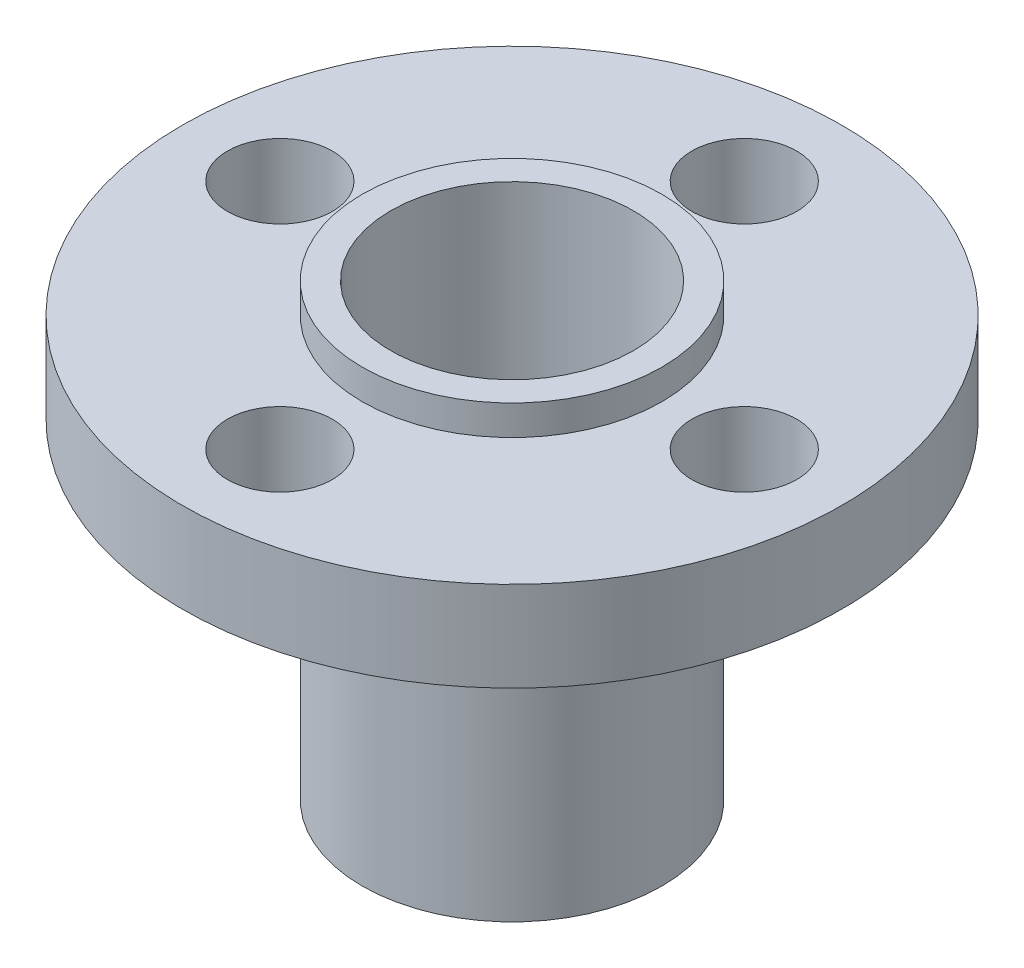
ISO-10303-21;
HEADER;
FILE_DESCRIPTION(('STEP AP214'),'2;1');
FILE_NAME('part.step','',(''),(''),'','','');
FILE_SCHEMA(('AUTOMOTIVE_DESIGN { 1 0 10303 214 1 1 1 1 }'));
ENDSEC;
DATA;
#1=APPLICATION_CONTEXT('core data for automotive mechanical design processes');
#2=APPLICATION_PROTOCOL_DEFINITION('international standard','automotive_design',2000,#1);
#3=PRODUCT_CONTEXT('',#1,'mechanical');
#4=PRODUCT('Part','Part','',(#3));
#5=PRODUCT_RELATED_PRODUCT_CATEGORY('part','',(#4));
#6=PRODUCT_DEFINITION_FORMATION('','',#4);
#7=PRODUCT_DEFINITION_CONTEXT('part definition',#1,'design');
#8=PRODUCT_DEFINITION('design','',#6,#7);
#9=PRODUCT_DEFINITION_SHAPE('','',#8);
#10=(LENGTH_UNIT() NAMED_UNIT(*) SI_UNIT(.MILLI.,.METRE.));
#11=(NAMED_UNIT(*) PLANE_ANGLE_UNIT() SI_UNIT($,.RADIAN.));
#12=(NAMED_UNIT(*) SI_UNIT($,.STERADIAN.) SOLID_ANGLE_UNIT());
#13=UNCERTAINTY_MEASURE_WITH_UNIT(LENGTH_MEASURE(1.E-05),#10,'distance_accuracy_value','');
#14=(GEOMETRIC_REPRESENTATION_CONTEXT(3) GLOBAL_UNCERTAINTY_ASSIGNED_CONTEXT((#13)) GLOBAL_UNIT_ASSIGNED_CONTEXT((#10,
#11,#12)) REPRESENTATION_CONTEXT('',''));
#15=CARTESIAN_POINT('',(0.,0.,0.));
#16=DIRECTION('',(0.,0.,1.));
#17=DIRECTION('',(1.,0.,0.));
#18=AXIS2_PLACEMENT_3D('',#15,#16,#17);
#19=CARTESIAN_POINT('',(0.,6.57294920269604,0.));
#20=DIRECTION('',(0.,-1.,0.));
#21=DIRECTION('',(1.,0.,0.));
#22=AXIS2_PLACEMENT_3D('',#19,#20,#21);
#23=PLANE('',#22);
#24=CARTESIAN_POINT('',(0.,6.57294920269604,0.));
#25=DIRECTION('',(0.,1.,0.));
#26=DIRECTION('',(-1.,0.,0.));
#27=AXIS2_PLACEMENT_3D('',#24,#25,#26);
#28=CIRCLE('',#27,4.05);
#29=CARTESIAN_POINT('',(-4.05,6.57294920269604,0.));
#30=VERTEX_POINT('',#29);
#31=EDGE_CURVE('E60',#30,#30,#28,.T.);
#32=ORIENTED_EDGE('',*,*,#31,.F.);
#33=EDGE_LOOP('',(#32));
#34=FACE_BOUND('',#33,.T.);
#35=CARTESIAN_POINT('',(0.,6.57294920269603,0.));
#36=DIRECTION('',(0.,1.,0.));
#37=DIRECTION('',(-1.,0.,0.));
#38=AXIS2_PLACEMENT_3D('',#35,#36,#37);
#39=CIRCLE('',#38,5.);
#40=CARTESIAN_POINT('',(-5.,6.57294920269603,0.));
#41=VERTEX_POINT('',#40);
#42=EDGE_CURVE('E10',#41,#41,#39,.T.);
#43=ORIENTED_EDGE('',*,*,#42,.T.);
#44=EDGE_LOOP('',(#43));
#45=FACE_BOUND('',#44,.T.);
#46=ADVANCED_FACE('F32',(#34,#45),#23,.F.);
#47=CARTESIAN_POINT('',(0.,6.57294920269604,0.));
#48=DIRECTION('',(0.,1.,0.));
#49=DIRECTION('',(-1.,0.,0.));
#50=AXIS2_PLACEMENT_3D('',#47,#48,#49);
#51=CYLINDRICAL_SURFACE('',#50,5.);
#52=ORIENTED_EDGE('',*,*,#42,.F.);
#53=EDGE_LOOP('',(#52));
#54=FACE_BOUND('',#53,.T.);
#55=CARTESIAN_POINT('',(0.,5.57294920269603,0.));
#56=DIRECTION('',(0.,1.,0.));
#57=DIRECTION('',(-1.,0.,0.));
#58=AXIS2_PLACEMENT_3D('',#55,#56,#57);
#59=CIRCLE('',#58,5.);
#60=CARTESIAN_POINT('',(-5.,5.57294920269603,0.));
#61=VERTEX_POINT('',#60);
#62=EDGE_CURVE('E38',#61,#61,#59,.T.);
#63=ORIENTED_EDGE('',*,*,#62,.T.);
#64=EDGE_LOOP('',(#63));
#65=FACE_BOUND('',#64,.T.);
#66=ADVANCED_FACE('F95',(#54,#65),#51,.T.);
#67=CARTESIAN_POINT('',(5.,5.57294920269604,0.));
#68=DIRECTION('',(0.,-1.,0.));
#69=DIRECTION('',(1.,0.,0.));
#70=AXIS2_PLACEMENT_3D('',#67,#68,#69);
#71=PLANE('',#70);
#72=CARTESIAN_POINT('',(-7.74999999999978,5.57294920269603,2.20268248085631E-13));
#73=DIRECTION('',(0.,1.,0.));
#74=DIRECTION('',(-1.,0.,0.));
#75=AXIS2_PLACEMENT_3D('',#72,#73,#74);
#76=CIRCLE('',#75,1.75000000000035);
#77=CARTESIAN_POINT('',(-9.50000000000014,5.57294920269603,2.20268248085631E-13));
#78=VERTEX_POINT('',#77);
#79=EDGE_CURVE('E84',#78,#78,#76,.T.);
#80=ORIENTED_EDGE('',*,*,#79,.F.);
#81=EDGE_LOOP('',(#80));
#82=FACE_BOUND('',#81,.T.);
#83=CARTESIAN_POINT('',(4.37993791911761E-13,5.57294920269603,7.75));
#84=DIRECTION('',(0.,1.,0.));
#85=DIRECTION('',(-1.,0.,0.));
#86=AXIS2_PLACEMENT_3D('',#83,#84,#85);
#87=CIRCLE('',#86,1.75000000000047);
#88=CARTESIAN_POINT('',(-1.75000000000003,5.57294920269603,7.75));
#89=VERTEX_POINT('',#88);
#90=EDGE_CURVE('E78',#89,#89,#87,.T.);
#91=ORIENTED_EDGE('',*,*,#90,.F.);
#92=EDGE_LOOP('',(#91));
#93=FACE_BOUND('',#92,.T.);
#94=CARTESIAN_POINT('',(7.75000000000022,5.57294920269604,-2.19319146816292E-13));
#95=DIRECTION('',(0.,1.,0.));
#96=DIRECTION('',(-1.,0.,0.));
#97=AXIS2_PLACEMENT_3D('',#94,#95,#96);
#98=CIRCLE('',#97,1.75000000000017);
#99=CARTESIAN_POINT('',(6.00000000000005,5.57294920269604,-2.19319146816292E-13));
#100=VERTEX_POINT('',#99);
#101=EDGE_CURVE('E72',#100,#100,#98,.T.);
#102=ORIENTED_EDGE('',*,*,#101,.F.);
#103=EDGE_LOOP('',(#102));
#104=FACE_BOUND('',#103,.T.);
#105=CARTESIAN_POINT('',(0.,5.57294920269603,-7.75));
#106=DIRECTION('',(0.,1.,0.));
#107=DIRECTION('',(-1.,0.,0.));
#108=AXIS2_PLACEMENT_3D('',#105,#106,#107);
#109=CIRCLE('',#108,1.75);
#110=CARTESIAN_POINT('',(-1.75,5.57294920269603,-7.75));
#111=VERTEX_POINT('',#110);
#112=EDGE_CURVE('E66',#111,#111,#109,.T.);
#113=ORIENTED_EDGE('',*,*,#112,.F.);
#114=EDGE_LOOP('',(#113));
#115=FACE_BOUND('',#114,.T.);
#116=ORIENTED_EDGE('',*,*,#62,.F.);
#117=EDGE_LOOP('',(#116));
#118=FACE_BOUND('',#117,.T.);
#119=CARTESIAN_POINT('',(0.,5.57294920269603,0.));
#120=DIRECTION('',(0.,1.,0.));
#121=DIRECTION('',(-1.,0.,0.));
#122=AXIS2_PLACEMENT_3D('',#119,#120,#121);
#123=CIRCLE('',#122,11.);
#124=CARTESIAN_POINT('',(-11.,5.57294920269603,0.));
#125=VERTEX_POINT('',#124);
#126=EDGE_CURVE('E42',#125,#125,#123,.T.);
#127=ORIENTED_EDGE('',*,*,#126,.T.);
#128=EDGE_LOOP('',(#127));
#129=FACE_BOUND('',#128,.T.);
#130=ADVANCED_FACE('F91',(#82,#93,#104,#115,#118,#129),#71,.F.);
#131=CARTESIAN_POINT('',(0.,6.57294920269604,0.));
#132=DIRECTION('',(0.,1.,0.));
#133=DIRECTION('',(-1.,0.,0.));
#134=AXIS2_PLACEMENT_3D('',#131,#132,#133);
#135=CYLINDRICAL_SURFACE('',#134,11.);
#136=ORIENTED_EDGE('',*,*,#126,.F.);
#137=EDGE_LOOP('',(#136));
#138=FACE_BOUND('',#137,.T.);
#139=CARTESIAN_POINT('',(0.,2.57294920269603,0.));
#140=DIRECTION('',(0.,1.,0.));
#141=DIRECTION('',(-1.,0.,0.));
#142=AXIS2_PLACEMENT_3D('',#139,#140,#141);
#143=CIRCLE('',#142,11.);
#144=CARTESIAN_POINT('',(-11.,2.57294920269603,0.));
#145=VERTEX_POINT('',#144);
#146=EDGE_CURVE('E46',#145,#145,#143,.T.);
#147=ORIENTED_EDGE('',*,*,#146,.T.);
#148=EDGE_LOOP('',(#147));
#149=FACE_BOUND('',#148,.T.);
#150=ADVANCED_FACE('F94',(#138,#149),#135,.T.);
#151=CARTESIAN_POINT('',(11.,2.57294920269603,0.));
#152=DIRECTION('',(0.,1.,0.));
#153=DIRECTION('',(-1.,0.,0.));
#154=AXIS2_PLACEMENT_3D('',#151,#152,#153);
#155=PLANE('',#154);
#156=CARTESIAN_POINT('',(-7.74999999999978,2.57294920269603,2.20268248085631E-13));
#157=DIRECTION('',(0.,1.,0.));
#158=DIRECTION('',(-1.,0.,0.));
#159=AXIS2_PLACEMENT_3D('',#156,#157,#158);
#160=CIRCLE('',#159,1.75000000000035);
#161=CARTESIAN_POINT('',(-9.50000000000014,2.57294920269603,2.20268248085631E-13));
#162=VERTEX_POINT('',#161);
#163=EDGE_CURVE('E81',#162,#162,#160,.F.);
#164=ORIENTED_EDGE('',*,*,#163,.F.);
#165=EDGE_LOOP('',(#164));
#166=FACE_BOUND('',#165,.T.);
#167=CARTESIAN_POINT('',(4.38340736606956E-13,2.57294920269603,7.75));
#168=DIRECTION('',(0.,1.,0.));
#169=DIRECTION('',(-1.,0.,0.));
#170=AXIS2_PLACEMENT_3D('',#167,#168,#169);
#171=CIRCLE('',#170,1.75000000000047);
#172=CARTESIAN_POINT('',(-1.75000000000003,2.57294920269603,7.75));
#173=VERTEX_POINT('',#172);
#174=EDGE_CURVE('E75',#173,#173,#171,.F.);
#175=ORIENTED_EDGE('',*,*,#174,.F.);
#176=EDGE_LOOP('',(#175));
#177=FACE_BOUND('',#176,.T.);
#178=CARTESIAN_POINT('',(7.75000000000022,2.57294920269603,-2.19319146816292E-13));
#179=DIRECTION('',(0.,1.,0.));
#180=DIRECTION('',(-1.,0.,0.));
#181=AXIS2_PLACEMENT_3D('',#178,#179,#180);
#182=CIRCLE('',#181,1.75000000000017);
#183=CARTESIAN_POINT('',(6.00000000000005,2.57294920269603,-2.19319146816292E-13));
#184=VERTEX_POINT('',#183);
#185=EDGE_CURVE('E69',#184,#184,#182,.F.);
#186=ORIENTED_EDGE('',*,*,#185,.F.);
#187=EDGE_LOOP('',(#186));
#188=FACE_BOUND('',#187,.T.);
#189=CARTESIAN_POINT('',(0.,2.57294920269603,-7.75));
#190=DIRECTION('',(0.,1.,0.));
#191=DIRECTION('',(-1.,0.,0.));
#192=AXIS2_PLACEMENT_3D('',#189,#190,#191);
#193=CIRCLE('',#192,1.75);
#194=CARTESIAN_POINT('',(-1.75,2.57294920269603,-7.75));
#195=VERTEX_POINT('',#194);
#196=EDGE_CURVE('E63',#195,#195,#193,.F.);
#197=ORIENTED_EDGE('',*,*,#196,.F.);
#198=EDGE_LOOP('',(#197));
#199=FACE_BOUND('',#198,.T.);
#200=ORIENTED_EDGE('',*,*,#146,.F.);
#201=EDGE_LOOP('',(#200));
#202=FACE_BOUND('',#201,.T.);
#203=CARTESIAN_POINT('',(0.,2.57294920269603,0.));
#204=DIRECTION('',(0.,1.,0.));
#205=DIRECTION('',(-1.,0.,0.));
#206=AXIS2_PLACEMENT_3D('',#203,#204,#205);
#207=CIRCLE('',#206,5.);
#208=CARTESIAN_POINT('',(-5.,2.57294920269603,0.));
#209=VERTEX_POINT('',#208);
#210=EDGE_CURVE('E51',#209,#209,#207,.T.);
#211=ORIENTED_EDGE('',*,*,#210,.T.);
#212=EDGE_LOOP('',(#211));
#213=FACE_BOUND('',#212,.T.);
#214=ADVANCED_FACE('F108',(#166,#177,#188,#199,#202,#213),#155,.F.);
#215=CARTESIAN_POINT('',(0.,6.57294920269604,0.));
#216=DIRECTION('',(0.,1.,0.));
#217=DIRECTION('',(-1.,0.,0.));
#218=AXIS2_PLACEMENT_3D('',#215,#216,#217);
#219=CYLINDRICAL_SURFACE('',#218,5.);
#220=ORIENTED_EDGE('',*,*,#210,.F.);
#221=EDGE_LOOP('',(#220));
#222=FACE_BOUND('',#221,.T.);
#223=CARTESIAN_POINT('',(0.,-8.42705079730396,0.));
#224=DIRECTION('',(0.,1.,0.));
#225=DIRECTION('',(-1.,0.,0.));
#226=AXIS2_PLACEMENT_3D('',#223,#224,#225);
#227=CIRCLE('',#226,4.99999999999999);
#228=CARTESIAN_POINT('',(-4.99999999999999,-8.42705079730396,0.));
#229=VERTEX_POINT('',#228);
#230=EDGE_CURVE('E54',#229,#229,#227,.T.);
#231=ORIENTED_EDGE('',*,*,#230,.T.);
#232=EDGE_LOOP('',(#231));
#233=FACE_BOUND('',#232,.T.);
#234=ADVANCED_FACE('F114',(#222,#233),#219,.T.);
#235=CARTESIAN_POINT('',(5.,-8.42705079730396,0.));
#236=DIRECTION('',(0.,1.,0.));
#237=DIRECTION('',(-1.,0.,0.));
#238=AXIS2_PLACEMENT_3D('',#235,#236,#237);
#239=PLANE('',#238);
#240=CARTESIAN_POINT('',(0.,-8.42705079730396,0.));
#241=DIRECTION('',(0.,1.,0.));
#242=DIRECTION('',(-1.,0.,0.));
#243=AXIS2_PLACEMENT_3D('',#240,#241,#242);
#244=CIRCLE('',#243,4.05);
#245=CARTESIAN_POINT('',(-4.05,-8.42705079730397,0.));
#246=VERTEX_POINT('',#245);
#247=EDGE_CURVE('E57',#246,#246,#244,.F.);
#248=ORIENTED_EDGE('',*,*,#247,.F.);
#249=EDGE_LOOP('',(#248));
#250=FACE_BOUND('',#249,.T.);
#251=ORIENTED_EDGE('',*,*,#230,.F.);
#252=EDGE_LOOP('',(#251));
#253=FACE_BOUND('',#252,.T.);
#254=ADVANCED_FACE('F121',(#250,#253),#239,.F.);
#255=CARTESIAN_POINT('',(0.,-8.42805079730396,0.));
#256=DIRECTION('',(0.,1.,0.));
#257=DIRECTION('',(-1.,0.,0.));
#258=AXIS2_PLACEMENT_3D('',#255,#256,#257);
#259=CYLINDRICAL_SURFACE('',#258,4.05);
#260=CARTESIAN_POINT('',(-4.05,6.57294920269604,0.));
#261=CARTESIAN_POINT('',(-4.05,6.41669920269603,0.));
#262=CARTESIAN_POINT('',(-4.05,6.26044920269603,0.));
#263=CARTESIAN_POINT('',(-4.05,5.94794920269603,0.));
#264=CARTESIAN_POINT('',(-4.05,5.79169920269603,0.));
#265=CARTESIAN_POINT('',(-4.05,5.47919920269603,0.));
#266=CARTESIAN_POINT('',(-4.05,5.32294920269603,0.));
#267=CARTESIAN_POINT('',(-4.05,5.01044920269603,0.));
#268=CARTESIAN_POINT('',(-4.05,4.85419920269603,0.));
#269=CARTESIAN_POINT('',(-4.05,4.54169920269604,0.));
#270=CARTESIAN_POINT('',(-4.05,4.38544920269603,0.));
#271=CARTESIAN_POINT('',(-4.05,4.07294920269603,0.));
#272=CARTESIAN_POINT('',(-4.05,3.91669920269603,0.));
#273=CARTESIAN_POINT('',(-4.05,3.60419920269603,0.));
#274=CARTESIAN_POINT('',(-4.05,3.44794920269603,0.));
#275=CARTESIAN_POINT('',(-4.05,3.13544920269603,0.));
#276=CARTESIAN_POINT('',(-4.05,2.97919920269603,0.));
#277=CARTESIAN_POINT('',(-4.05,2.66669920269603,0.));
#278=CARTESIAN_POINT('',(-4.05,2.51044920269603,0.));
#279=CARTESIAN_POINT('',(-4.05,2.19794920269603,0.));
#280=CARTESIAN_POINT('',(-4.05,2.04169920269603,0.));
#281=CARTESIAN_POINT('',(-4.05,1.72919920269603,0.));
#282=CARTESIAN_POINT('',(-4.05,1.57294920269603,0.));
#283=CARTESIAN_POINT('',(-4.05,1.26044920269603,0.));
#284=CARTESIAN_POINT('',(-4.05,1.10419920269603,0.));
#285=CARTESIAN_POINT('',(-4.05,0.791699202696033,0.));
#286=CARTESIAN_POINT('',(-4.05,0.635449202696033,0.));
#287=CARTESIAN_POINT('',(-4.05,0.322949202696033,0.));
#288=CARTESIAN_POINT('',(-4.05,0.166699202696033,0.));
#289=CARTESIAN_POINT('',(-4.05,-0.145800797303967,0.));
#290=CARTESIAN_POINT('',(-4.05,-0.302050797303966,0.));
#291=CARTESIAN_POINT('',(-4.05,-0.614550797303966,0.));
#292=CARTESIAN_POINT('',(-4.05,-0.770800797303966,0.));
#293=CARTESIAN_POINT('',(-4.05,-1.08330079730397,0.));
#294=CARTESIAN_POINT('',(-4.05,-1.23955079730397,0.));
#295=CARTESIAN_POINT('',(-4.05,-1.55205079730397,0.));
#296=CARTESIAN_POINT('',(-4.05,-1.70830079730397,0.));
#297=CARTESIAN_POINT('',(-4.05,-2.02080079730397,0.));
#298=CARTESIAN_POINT('',(-4.05,-2.17705079730397,0.));
#299=CARTESIAN_POINT('',(-4.05,-2.48955079730397,0.));
#300=CARTESIAN_POINT('',(-4.05,-2.64580079730397,0.));
#301=CARTESIAN_POINT('',(-4.05,-2.95830079730397,0.));
#302=CARTESIAN_POINT('',(-4.05,-3.11455079730397,0.));
#303=CARTESIAN_POINT('',(-4.05,-3.42705079730397,0.));
#304=CARTESIAN_POINT('',(-4.05,-3.58330079730397,0.));
#305=CARTESIAN_POINT('',(-4.05,-3.89580079730397,0.));
#306=CARTESIAN_POINT('',(-4.05,-4.05205079730397,0.));
#307=CARTESIAN_POINT('',(-4.05,-4.36455079730397,0.));
#308=CARTESIAN_POINT('',(-4.05,-4.52080079730397,0.));
#309=CARTESIAN_POINT('',(-4.05,-4.83330079730397,0.));
#310=CARTESIAN_POINT('',(-4.05,-4.98955079730397,0.));
#311=CARTESIAN_POINT('',(-4.05,-5.30205079730397,0.));
#312=CARTESIAN_POINT('',(-4.05,-5.45830079730397,0.));
#313=CARTESIAN_POINT('',(-4.05,-5.77080079730397,0.));
#314=CARTESIAN_POINT('',(-4.05,-5.92705079730397,0.));
#315=CARTESIAN_POINT('',(-4.05,-6.23955079730397,0.));
#316=CARTESIAN_POINT('',(-4.05,-6.39580079730397,0.));
#317=CARTESIAN_POINT('',(-4.05,-6.70830079730397,0.));
#318=CARTESIAN_POINT('',(-4.05,-6.86455079730397,0.));
#319=CARTESIAN_POINT('',(-4.05,-7.17705079730397,0.));
#320=CARTESIAN_POINT('',(-4.05,-7.33330079730397,0.));
#321=CARTESIAN_POINT('',(-4.05,-7.64580079730397,0.));
#322=CARTESIAN_POINT('',(-4.05,-7.80205079730397,0.));
#323=CARTESIAN_POINT('',(-4.05,-8.11455079730397,0.));
#324=CARTESIAN_POINT('',(-4.05,-8.27080079730397,0.));
#325=CARTESIAN_POINT('',(-4.05,-8.42705079730397,0.));
#326=B_SPLINE_CURVE_WITH_KNOTS('',3,(#260,#261,#262,#263,#264,#265,#266,#267,#268,#269,#270,
#271,#272,#273,#274,#275,#276,#277,#278,#279,#280,#281,#282,#283,#284,#285,#286,#287,#288,#289,
#290,#291,#292,#293,#294,#295,#296,#297,#298,#299,#300,#301,#302,#303,#304,#305,#306,#307,#308,
#309,#310,#311,#312,#313,#314,#315,#316,#317,#318,#319,#320,#321,#322,#323,#324,#325),
.UNSPECIFIED.,.F.,.F.,(4,2,2,2,2,2,2,2,2,2,2,2,2,2,2,2,2,2,2,2,2,2,2,2,2,2,2,2,2,2,2,2,4),(0.,
0.46875,0.937500000000001,1.40625,1.875,2.34375,2.8125,3.28125,3.75,4.21875,4.6875,5.15625,
5.625,6.09375,6.5625,7.03125,7.5,7.96875,8.4375,8.90625,9.375,9.84375,10.3125,10.78125,11.25,
11.71875,12.1875,12.65625,13.125,13.59375,14.0625,14.53125,15.),.UNSPECIFIED.);
#327=EDGE_CURVE('BSEAM126',#30,#246,#326,.T.);
#328=ORIENTED_EDGE('',*,*,#31,.T.);
#329=ORIENTED_EDGE('',*,*,#247,.T.);
#330=ORIENTED_EDGE('',*,*,#327,.T.);
#331=ORIENTED_EDGE('',*,*,#327,.F.);
#332=EDGE_LOOP('',(#328,#330,#329,#331));
#333=FACE_BOUND('',#332,.T.);
#334=ADVANCED_FACE('F126',(#333),#259,.F.);
#335=CARTESIAN_POINT('',(0.,-8.42805079730397,-7.75));
#336=DIRECTION('',(0.,1.,0.));
#337=DIRECTION('',(-1.,0.,0.));
#338=AXIS2_PLACEMENT_3D('',#335,#336,#337);
#339=CYLINDRICAL_SURFACE('',#338,1.75);
#340=CARTESIAN_POINT('',(-1.75,5.57294920269603,-7.75));
#341=CARTESIAN_POINT('',(-1.75,5.54169920269603,-7.75));
#342=CARTESIAN_POINT('',(-1.75,5.51044920269603,-7.75));
#343=CARTESIAN_POINT('',(-1.75,5.44794920269603,-7.75));
#344=CARTESIAN_POINT('',(-1.75,5.41669920269603,-7.75));
#345=CARTESIAN_POINT('',(-1.75,5.35419920269603,-7.75));
#346=CARTESIAN_POINT('',(-1.75,5.32294920269603,-7.75));
#347=CARTESIAN_POINT('',(-1.75,5.26044920269603,-7.75));
#348=CARTESIAN_POINT('',(-1.75,5.22919920269603,-7.75));
#349=CARTESIAN_POINT('',(-1.75,5.16669920269603,-7.75));
#350=CARTESIAN_POINT('',(-1.75,5.13544920269603,-7.75));
#351=CARTESIAN_POINT('',(-1.75,5.07294920269603,-7.75));
#352=CARTESIAN_POINT('',(-1.75,5.04169920269603,-7.75));
#353=CARTESIAN_POINT('',(-1.75,4.97919920269603,-7.75));
#354=CARTESIAN_POINT('',(-1.75,4.94794920269603,-7.75));
#355=CARTESIAN_POINT('',(-1.75,4.88544920269603,-7.75));
#356=CARTESIAN_POINT('',(-1.75,4.85419920269603,-7.75));
#357=CARTESIAN_POINT('',(-1.75,4.79169920269603,-7.75));
#358=CARTESIAN_POINT('',(-1.75,4.76044920269603,-7.75));
#359=CARTESIAN_POINT('',(-1.75,4.69794920269603,-7.75));
#360=CARTESIAN_POINT('',(-1.75,4.66669920269603,-7.75));
#361=CARTESIAN_POINT('',(-1.75,4.60419920269603,-7.75));
#362=CARTESIAN_POINT('',(-1.75,4.57294920269603,-7.75));
#363=CARTESIAN_POINT('',(-1.75,4.51044920269603,-7.75));
#364=CARTESIAN_POINT('',(-1.75,4.47919920269603,-7.75));
#365=CARTESIAN_POINT('',(-1.75,4.41669920269603,-7.75));
#366=CARTESIAN_POINT('',(-1.75,4.38544920269603,-7.75));
#367=CARTESIAN_POINT('',(-1.75,4.32294920269603,-7.75));
#368=CARTESIAN_POINT('',(-1.75,4.29169920269603,-7.75));
#369=CARTESIAN_POINT('',(-1.75,4.22919920269603,-7.75));
#370=CARTESIAN_POINT('',(-1.75,4.19794920269603,-7.75));
#371=CARTESIAN_POINT('',(-1.75,4.13544920269603,-7.75));
#372=CARTESIAN_POINT('',(-1.75,4.10419920269603,-7.75));
#373=CARTESIAN_POINT('',(-1.75,4.04169920269603,-7.75));
#374=CARTESIAN_POINT('',(-1.75,4.01044920269603,-7.75));
#375=CARTESIAN_POINT('',(-1.75,3.94794920269603,-7.75));
#376=CARTESIAN_POINT('',(-1.75,3.91669920269603,-7.75));
#377=CARTESIAN_POINT('',(-1.75,3.85419920269603,-7.75));
#378=CARTESIAN_POINT('',(-1.75,3.82294920269603,-7.75));
#379=CARTESIAN_POINT('',(-1.75,3.76044920269603,-7.75));
#380=CARTESIAN_POINT('',(-1.75,3.72919920269603,-7.75));
#381=CARTESIAN_POINT('',(-1.75,3.66669920269603,-7.75));
#382=CARTESIAN_POINT('',(-1.75,3.63544920269603,-7.75));
#383=CARTESIAN_POINT('',(-1.75,3.57294920269603,-7.75));
#384=CARTESIAN_POINT('',(-1.75,3.54169920269603,-7.75));
#385=CARTESIAN_POINT('',(-1.75,3.47919920269603,-7.75));
#386=CARTESIAN_POINT('',(-1.75,3.44794920269603,-7.75));
#387=CARTESIAN_POINT('',(-1.75,3.38544920269603,-7.75));
#388=CARTESIAN_POINT('',(-1.75,3.35419920269603,-7.75));
#389=CARTESIAN_POINT('',(-1.75,3.29169920269603,-7.75));
#390=CARTESIAN_POINT('',(-1.75,3.26044920269603,-7.75));
#391=CARTESIAN_POINT('',(-1.75,3.19794920269603,-7.75));
#392=CARTESIAN_POINT('',(-1.75,3.16669920269603,-7.75));
#393=CARTESIAN_POINT('',(-1.75,3.10419920269603,-7.75));
#394=CARTESIAN_POINT('',(-1.75,3.07294920269603,-7.75));
#395=CARTESIAN_POINT('',(-1.75,3.01044920269603,-7.75));
#396=CARTESIAN_POINT('',(-1.75,2.97919920269603,-7.75));
#397=CARTESIAN_POINT('',(-1.75,2.91669920269603,-7.75));
#398=CARTESIAN_POINT('',(-1.75,2.88544920269603,-7.75));
#399=CARTESIAN_POINT('',(-1.75,2.82294920269603,-7.75));
#400=CARTESIAN_POINT('',(-1.75,2.79169920269603,-7.75));
#401=CARTESIAN_POINT('',(-1.75,2.72919920269603,-7.75));
#402=CARTESIAN_POINT('',(-1.75,2.69794920269603,-7.75));
#403=CARTESIAN_POINT('',(-1.75,2.63544920269603,-7.75));
#404=CARTESIAN_POINT('',(-1.75,2.60419920269603,-7.75));
#405=CARTESIAN_POINT('',(-1.75,2.57294920269603,-7.75));
#406=B_SPLINE_CURVE_WITH_KNOTS('',3,(#340,#341,#342,#343,#344,#345,#346,#347,#348,#349,#350,
#351,#352,#353,#354,#355,#356,#357,#358,#359,#360,#361,#362,#363,#364,#365,#366,#367,#368,#369,
#370,#371,#372,#373,#374,#375,#376,#377,#378,#379,#380,#381,#382,#383,#384,#385,#386,#387,#388,
#389,#390,#391,#392,#393,#394,#395,#396,#397,#398,#399,#400,#401,#402,#403,#404,#405),
.UNSPECIFIED.,.F.,.F.,(4,2,2,2,2,2,2,2,2,2,2,2,2,2,2,2,2,2,2,2,2,2,2,2,2,2,2,2,2,2,2,2,4),(0.,
0.0937500000000001,0.1875,0.28125,0.375,0.46875,0.5625,0.656250000000001,0.750000000000001,
0.843749999999999,0.937499999999999,1.03125,1.125,1.21875,1.3125,1.40625,1.5,1.59375,1.6875,
1.78125,1.875,1.96875,2.0625,2.15625,2.25,2.34375,2.4375,2.53125,2.625,2.71875,2.8125,2.90625,
3.),.UNSPECIFIED.);
#407=EDGE_CURVE('BSEAM132',#111,#195,#406,.T.);
#408=ORIENTED_EDGE('',*,*,#112,.T.);
#409=ORIENTED_EDGE('',*,*,#196,.T.);
#410=ORIENTED_EDGE('',*,*,#407,.T.);
#411=ORIENTED_EDGE('',*,*,#407,.F.);
#412=EDGE_LOOP('',(#408,#410,#409,#411));
#413=FACE_BOUND('',#412,.T.);
#414=ADVANCED_FACE('F132',(#413),#339,.F.);
#415=CARTESIAN_POINT('',(7.75000000000022,-8.42805079730397,-2.19319146816292E-13));
#416=DIRECTION('',(0.,1.,0.));
#417=DIRECTION('',(-1.,0.,0.));
#418=AXIS2_PLACEMENT_3D('',#415,#416,#417);
#419=CYLINDRICAL_SURFACE('',#418,1.75000000000017);
#420=CARTESIAN_POINT('',(6.00000000000005,5.57294920269604,-2.19319146816292E-13));
#421=CARTESIAN_POINT('',(6.00000000000005,5.54169920269604,-2.19319146816292E-13));
#422=CARTESIAN_POINT('',(6.00000000000005,5.51044920269604,-2.19319146816292E-13));
#423=CARTESIAN_POINT('',(6.00000000000005,5.44794920269604,-2.19319146816292E-13));
#424=CARTESIAN_POINT('',(6.00000000000005,5.41669920269604,-2.19319146816292E-13));
#425=CARTESIAN_POINT('',(6.00000000000005,5.35419920269604,-2.19319146816292E-13));
#426=CARTESIAN_POINT('',(6.00000000000005,5.32294920269604,-2.19319146816292E-13));
#427=CARTESIAN_POINT('',(6.00000000000005,5.26044920269604,-2.19319146816292E-13));
#428=CARTESIAN_POINT('',(6.00000000000005,5.22919920269604,-2.19319146816292E-13));
#429=CARTESIAN_POINT('',(6.00000000000005,5.16669920269604,-2.19319146816292E-13));
#430=CARTESIAN_POINT('',(6.00000000000005,5.13544920269604,-2.19319146816292E-13));
#431=CARTESIAN_POINT('',(6.00000000000005,5.07294920269604,-2.19319146816292E-13));
#432=CARTESIAN_POINT('',(6.00000000000005,5.04169920269604,-2.19319146816292E-13));
#433=CARTESIAN_POINT('',(6.00000000000005,4.97919920269604,-2.19319146816292E-13));
#434=CARTESIAN_POINT('',(6.00000000000005,4.94794920269604,-2.19319146816292E-13));
#435=CARTESIAN_POINT('',(6.00000000000005,4.88544920269604,-2.19319146816292E-13));
#436=CARTESIAN_POINT('',(6.00000000000005,4.85419920269604,-2.19319146816292E-13));
#437=CARTESIAN_POINT('',(6.00000000000005,4.79169920269604,-2.19319146816292E-13));
#438=CARTESIAN_POINT('',(6.00000000000005,4.76044920269604,-2.19319146816292E-13));
#439=CARTESIAN_POINT('',(6.00000000000005,4.69794920269604,-2.19319146816292E-13));
#440=CARTESIAN_POINT('',(6.00000000000005,4.66669920269604,-2.19319146816292E-13));
#441=CARTESIAN_POINT('',(6.00000000000005,4.60419920269604,-2.19319146816292E-13));
#442=CARTESIAN_POINT('',(6.00000000000005,4.57294920269604,-2.19319146816292E-13));
#443=CARTESIAN_POINT('',(6.00000000000005,4.51044920269604,-2.19319146816292E-13));
#444=CARTESIAN_POINT('',(6.00000000000005,4.47919920269603,-2.19319146816292E-13));
#445=CARTESIAN_POINT('',(6.00000000000005,4.41669920269603,-2.19319146816292E-13));
#446=CARTESIAN_POINT('',(6.00000000000005,4.38544920269603,-2.19319146816292E-13));
#447=CARTESIAN_POINT('',(6.00000000000005,4.32294920269603,-2.19319146816292E-13));
#448=CARTESIAN_POINT('',(6.00000000000005,4.29169920269603,-2.19319146816292E-13));
#449=CARTESIAN_POINT('',(6.00000000000005,4.22919920269603,-2.19319146816292E-13));
#450=CARTESIAN_POINT('',(6.00000000000005,4.19794920269603,-2.19319146816292E-13));
#451=CARTESIAN_POINT('',(6.00000000000005,4.13544920269603,-2.19319146816292E-13));
#452=CARTESIAN_POINT('',(6.00000000000005,4.10419920269603,-2.19319146816292E-13));
#453=CARTESIAN_POINT('',(6.00000000000005,4.04169920269603,-2.19319146816292E-13));
#454=CARTESIAN_POINT('',(6.00000000000005,4.01044920269603,-2.19319146816292E-13));
#455=CARTESIAN_POINT('',(6.00000000000005,3.94794920269603,-2.19319146816292E-13));
#456=CARTESIAN_POINT('',(6.00000000000005,3.91669920269603,-2.19319146816292E-13));
#457=CARTESIAN_POINT('',(6.00000000000005,3.85419920269603,-2.19319146816292E-13));
#458=CARTESIAN_POINT('',(6.00000000000005,3.82294920269603,-2.19319146816292E-13));
#459=CARTESIAN_POINT('',(6.00000000000005,3.76044920269603,-2.19319146816292E-13));
#460=CARTESIAN_POINT('',(6.00000000000005,3.72919920269603,-2.19319146816292E-13));
#461=CARTESIAN_POINT('',(6.00000000000005,3.66669920269603,-2.19319146816292E-13));
#462=CARTESIAN_POINT('',(6.00000000000005,3.63544920269603,-2.19319146816292E-13));
#463=CARTESIAN_POINT('',(6.00000000000005,3.57294920269603,-2.19319146816292E-13));
#464=CARTESIAN_POINT('',(6.00000000000005,3.54169920269603,-2.19319146816292E-13));
#465=CARTESIAN_POINT('',(6.00000000000005,3.47919920269603,-2.19319146816292E-13));
#466=CARTESIAN_POINT('',(6.00000000000005,3.44794920269603,-2.19319146816292E-13));
#467=CARTESIAN_POINT('',(6.00000000000005,3.38544920269603,-2.19319146816292E-13));
#468=CARTESIAN_POINT('',(6.00000000000005,3.35419920269603,-2.19319146816292E-13));
#469=CARTESIAN_POINT('',(6.00000000000005,3.29169920269603,-2.19319146816292E-13));
#470=CARTESIAN_POINT('',(6.00000000000005,3.26044920269603,-2.19319146816292E-13));
#471=CARTESIAN_POINT('',(6.00000000000005,3.19794920269603,-2.19319146816292E-13));
#472=CARTESIAN_POINT('',(6.00000000000005,3.16669920269603,-2.19319146816292E-13));
#473=CARTESIAN_POINT('',(6.00000000000005,3.10419920269603,-2.19319146816292E-13));
#474=CARTESIAN_POINT('',(6.00000000000005,3.07294920269603,-2.19319146816292E-13));
#475=CARTESIAN_POINT('',(6.00000000000005,3.01044920269603,-2.19319146816292E-13));
#476=CARTESIAN_POINT('',(6.00000000000005,2.97919920269603,-2.19319146816292E-13));
#477=CARTESIAN_POINT('',(6.00000000000005,2.91669920269603,-2.19319146816292E-13));
#478=CARTESIAN_POINT('',(6.00000000000005,2.88544920269603,-2.19319146816292E-13));
#479=CARTESIAN_POINT('',(6.00000000000005,2.82294920269603,-2.19319146816292E-13));
#480=CARTESIAN_POINT('',(6.00000000000005,2.79169920269603,-2.19319146816292E-13));
#481=CARTESIAN_POINT('',(6.00000000000005,2.72919920269603,-2.19319146816292E-13));
#482=CARTESIAN_POINT('',(6.00000000000005,2.69794920269603,-2.19319146816292E-13));
#483=CARTESIAN_POINT('',(6.00000000000005,2.63544920269603,-2.19319146816292E-13));
#484=CARTESIAN_POINT('',(6.00000000000005,2.60419920269603,-2.19319146816292E-13));
#485=CARTESIAN_POINT('',(6.00000000000005,2.57294920269603,-2.19319146816292E-13));
#486=B_SPLINE_CURVE_WITH_KNOTS('',3,(#420,#421,#422,#423,#424,#425,#426,#427,#428,#429,#430,
#431,#432,#433,#434,#435,#436,#437,#438,#439,#440,#441,#442,#443,#444,#445,#446,#447,#448,#449,
#450,#451,#452,#453,#454,#455,#456,#457,#458,#459,#460,#461,#462,#463,#464,#465,#466,#467,#468,
#469,#470,#471,#472,#473,#474,#475,#476,#477,#478,#479,#480,#481,#482,#483,#484,#485),
.UNSPECIFIED.,.F.,.F.,(4,2,2,2,2,2,2,2,2,2,2,2,2,2,2,2,2,2,2,2,2,2,2,2,2,2,2,2,2,2,2,2,4),(0.,
0.0937500000000001,0.1875,0.28125,0.375,0.46875,0.5625,0.656250000000001,0.750000000000001,
0.843750000000001,0.937500000000001,1.03125,1.125,1.21875,1.3125,1.40625,1.5,1.59375,1.6875,
1.78125,1.875,1.96875,2.0625,2.15625,2.25,2.34375,2.4375,2.53125,2.625,2.71875,2.8125,2.90625,
3.),.UNSPECIFIED.);
#487=EDGE_CURVE('BSEAM185',#100,#184,#486,.T.);
#488=ORIENTED_EDGE('',*,*,#101,.T.);
#489=ORIENTED_EDGE('',*,*,#185,.T.);
#490=ORIENTED_EDGE('',*,*,#487,.T.);
#491=ORIENTED_EDGE('',*,*,#487,.F.);
#492=EDGE_LOOP('',(#488,#490,#489,#491));
#493=FACE_BOUND('',#492,.T.);
#494=ADVANCED_FACE('F185',(#493),#419,.F.);
#495=CARTESIAN_POINT('',(4.39612982804238E-13,-8.42805079730397,7.75));
#496=DIRECTION('',(0.,1.,0.));
#497=DIRECTION('',(-1.,0.,0.));
#498=AXIS2_PLACEMENT_3D('',#495,#496,#497);
#499=CYLINDRICAL_SURFACE('',#498,1.75000000000047);
#500=CARTESIAN_POINT('',(-1.75000000000003,5.57294920269603,7.75));
#501=CARTESIAN_POINT('',(-1.75000000000003,5.54169920269603,7.75));
#502=CARTESIAN_POINT('',(-1.75000000000003,5.51044920269603,7.75));
#503=CARTESIAN_POINT('',(-1.75000000000003,5.44794920269603,7.75));
#504=CARTESIAN_POINT('',(-1.75000000000003,5.41669920269603,7.75));
#505=CARTESIAN_POINT('',(-1.75000000000003,5.35419920269603,7.75));
#506=CARTESIAN_POINT('',(-1.75000000000003,5.32294920269603,7.75));
#507=CARTESIAN_POINT('',(-1.75000000000003,5.26044920269603,7.75));
#508=CARTESIAN_POINT('',(-1.75000000000003,5.22919920269603,7.75));
#509=CARTESIAN_POINT('',(-1.75000000000003,5.16669920269603,7.75));
#510=CARTESIAN_POINT('',(-1.75000000000003,5.13544920269603,7.75));
#511=CARTESIAN_POINT('',(-1.75000000000003,5.07294920269603,7.75));
#512=CARTESIAN_POINT('',(-1.75000000000003,5.04169920269603,7.75));
#513=CARTESIAN_POINT('',(-1.75000000000003,4.97919920269603,7.75));
#514=CARTESIAN_POINT('',(-1.75000000000003,4.94794920269603,7.75));
#515=CARTESIAN_POINT('',(-1.75000000000003,4.88544920269603,7.75));
#516=CARTESIAN_POINT('',(-1.75000000000003,4.85419920269603,7.75));
#517=CARTESIAN_POINT('',(-1.75000000000003,4.79169920269603,7.75));
#518=CARTESIAN_POINT('',(-1.75000000000003,4.76044920269603,7.75));
#519=CARTESIAN_POINT('',(-1.75000000000003,4.69794920269603,7.75));
#520=CARTESIAN_POINT('',(-1.75000000000003,4.66669920269603,7.75));
#521=CARTESIAN_POINT('',(-1.75000000000003,4.60419920269603,7.75));
#522=CARTESIAN_POINT('',(-1.75000000000003,4.57294920269603,7.75));
#523=CARTESIAN_POINT('',(-1.75000000000003,4.51044920269603,7.75));
#524=CARTESIAN_POINT('',(-1.75000000000003,4.47919920269603,7.75));
#525=CARTESIAN_POINT('',(-1.75000000000003,4.41669920269603,7.75));
#526=CARTESIAN_POINT('',(-1.75000000000003,4.38544920269603,7.75));
#527=CARTESIAN_POINT('',(-1.75000000000003,4.32294920269603,7.75));
#528=CARTESIAN_POINT('',(-1.75000000000003,4.29169920269603,7.75));
#529=CARTESIAN_POINT('',(-1.75000000000003,4.22919920269603,7.75));
#530=CARTESIAN_POINT('',(-1.75000000000003,4.19794920269603,7.75));
#531=CARTESIAN_POINT('',(-1.75000000000003,4.13544920269603,7.75));
#532=CARTESIAN_POINT('',(-1.75000000000003,4.10419920269603,7.75));
#533=CARTESIAN_POINT('',(-1.75000000000003,4.04169920269603,7.75));
#534=CARTESIAN_POINT('',(-1.75000000000003,4.01044920269603,7.75));
#535=CARTESIAN_POINT('',(-1.75000000000003,3.94794920269603,7.75));
#536=CARTESIAN_POINT('',(-1.75000000000003,3.91669920269603,7.75));
#537=CARTESIAN_POINT('',(-1.75000000000003,3.85419920269603,7.75));
#538=CARTESIAN_POINT('',(-1.75000000000003,3.82294920269603,7.75));
#539=CARTESIAN_POINT('',(-1.75000000000003,3.76044920269603,7.75));
#540=CARTESIAN_POINT('',(-1.75000000000003,3.72919920269603,7.75));
#541=CARTESIAN_POINT('',(-1.75000000000003,3.66669920269603,7.75));
#542=CARTESIAN_POINT('',(-1.75000000000003,3.63544920269603,7.75));
#543=CARTESIAN_POINT('',(-1.75000000000003,3.57294920269603,7.75));
#544=CARTESIAN_POINT('',(-1.75000000000003,3.54169920269603,7.75));
#545=CARTESIAN_POINT('',(-1.75000000000003,3.47919920269603,7.75));
#546=CARTESIAN_POINT('',(-1.75000000000003,3.44794920269603,7.75));
#547=CARTESIAN_POINT('',(-1.75000000000003,3.38544920269603,7.75));
#548=CARTESIAN_POINT('',(-1.75000000000003,3.35419920269603,7.75));
#549=CARTESIAN_POINT('',(-1.75000000000003,3.29169920269603,7.75));
#550=CARTESIAN_POINT('',(-1.75000000000003,3.26044920269603,7.75));
#551=CARTESIAN_POINT('',(-1.75000000000003,3.19794920269603,7.75));
#552=CARTESIAN_POINT('',(-1.75000000000003,3.16669920269603,7.75));
#553=CARTESIAN_POINT('',(-1.75000000000003,3.10419920269603,7.75));
#554=CARTESIAN_POINT('',(-1.75000000000003,3.07294920269603,7.75));
#555=CARTESIAN_POINT('',(-1.75000000000003,3.01044920269603,7.75));
#556=CARTESIAN_POINT('',(-1.75000000000003,2.97919920269603,7.75));
#557=CARTESIAN_POINT('',(-1.75000000000003,2.91669920269603,7.75));
#558=CARTESIAN_POINT('',(-1.75000000000003,2.88544920269603,7.75));
#559=CARTESIAN_POINT('',(-1.75000000000003,2.82294920269603,7.75));
#560=CARTESIAN_POINT('',(-1.75000000000003,2.79169920269603,7.75));
#561=CARTESIAN_POINT('',(-1.75000000000003,2.72919920269603,7.75));
#562=CARTESIAN_POINT('',(-1.75000000000003,2.69794920269603,7.75));
#563=CARTESIAN_POINT('',(-1.75000000000003,2.63544920269603,7.75));
#564=CARTESIAN_POINT('',(-1.75000000000003,2.60419920269603,7.75));
#565=CARTESIAN_POINT('',(-1.75000000000003,2.57294920269603,7.75));
#566=B_SPLINE_CURVE_WITH_KNOTS('',3,(#500,#501,#502,#503,#504,#505,#506,#507,#508,#509,#510,
#511,#512,#513,#514,#515,#516,#517,#518,#519,#520,#521,#522,#523,#524,#525,#526,#527,#528,#529,
#530,#531,#532,#533,#534,#535,#536,#537,#538,#539,#540,#541,#542,#543,#544,#545,#546,#547,#548,
#549,#550,#551,#552,#553,#554,#555,#556,#557,#558,#559,#560,#561,#562,#563,#564,#565),
.UNSPECIFIED.,.F.,.F.,(4,2,2,2,2,2,2,2,2,2,2,2,2,2,2,2,2,2,2,2,2,2,2,2,2,2,2,2,2,2,2,2,4),(0.,
0.0937500000000001,0.1875,0.28125,0.375,0.46875,0.5625,0.656250000000001,0.750000000000001,
0.843749999999999,0.937499999999999,1.03125,1.125,1.21875,1.3125,1.40625,1.5,1.59375,1.6875,
1.78125,1.875,1.96875,2.0625,2.15625,2.25,2.34375,2.4375,2.53125,2.625,2.71875,2.8125,2.90625,
3.),.UNSPECIFIED.);
#567=EDGE_CURVE('BSEAM192',#89,#173,#566,.T.);
#568=ORIENTED_EDGE('',*,*,#90,.T.);
#569=ORIENTED_EDGE('',*,*,#174,.T.);
#570=ORIENTED_EDGE('',*,*,#567,.T.);
#571=ORIENTED_EDGE('',*,*,#567,.F.);
#572=EDGE_LOOP('',(#568,#570,#569,#571));
#573=FACE_BOUND('',#572,.T.);
#574=ADVANCED_FACE('F192',(#573),#499,.F.);
#575=CARTESIAN_POINT('',(-7.74999999999978,-8.42805079730397,2.20268248085631E-13));
#576=DIRECTION('',(0.,1.,0.));
#577=DIRECTION('',(-1.,0.,0.));
#578=AXIS2_PLACEMENT_3D('',#575,#576,#577);
#579=CYLINDRICAL_SURFACE('',#578,1.75000000000035);
#580=CARTESIAN_POINT('',(-9.50000000000014,5.57294920269603,2.20268248085631E-13));
#581=CARTESIAN_POINT('',(-9.50000000000014,5.54169920269603,2.20268248085631E-13));
#582=CARTESIAN_POINT('',(-9.50000000000014,5.51044920269603,2.20268248085631E-13));
#583=CARTESIAN_POINT('',(-9.50000000000014,5.44794920269603,2.20268248085631E-13));
#584=CARTESIAN_POINT('',(-9.50000000000014,5.41669920269603,2.20268248085631E-13));
#585=CARTESIAN_POINT('',(-9.50000000000014,5.35419920269603,2.20268248085631E-13));
#586=CARTESIAN_POINT('',(-9.50000000000014,5.32294920269603,2.20268248085631E-13));
#587=CARTESIAN_POINT('',(-9.50000000000014,5.26044920269603,2.20268248085631E-13));
#588=CARTESIAN_POINT('',(-9.50000000000014,5.22919920269603,2.20268248085631E-13));
#589=CARTESIAN_POINT('',(-9.50000000000014,5.16669920269603,2.20268248085631E-13));
#590=CARTESIAN_POINT('',(-9.50000000000014,5.13544920269603,2.20268248085631E-13));
#591=CARTESIAN_POINT('',(-9.50000000000014,5.07294920269603,2.20268248085631E-13));
#592=CARTESIAN_POINT('',(-9.50000000000014,5.04169920269603,2.20268248085631E-13));
#593=CARTESIAN_POINT('',(-9.50000000000014,4.97919920269603,2.20268248085631E-13));
#594=CARTESIAN_POINT('',(-9.50000000000014,4.94794920269603,2.20268248085631E-13));
#595=CARTESIAN_POINT('',(-9.50000000000014,4.88544920269603,2.20268248085631E-13));
#596=CARTESIAN_POINT('',(-9.50000000000014,4.85419920269603,2.20268248085631E-13));
#597=CARTESIAN_POINT('',(-9.50000000000014,4.79169920269603,2.20268248085631E-13));
#598=CARTESIAN_POINT('',(-9.50000000000014,4.76044920269603,2.20268248085631E-13));
#599=CARTESIAN_POINT('',(-9.50000000000014,4.69794920269603,2.20268248085631E-13));
#600=CARTESIAN_POINT('',(-9.50000000000014,4.66669920269603,2.20268248085631E-13));
#601=CARTESIAN_POINT('',(-9.50000000000014,4.60419920269603,2.20268248085631E-13));
#602=CARTESIAN_POINT('',(-9.50000000000014,4.57294920269603,2.20268248085631E-13));
#603=CARTESIAN_POINT('',(-9.50000000000014,4.51044920269603,2.20268248085631E-13));
#604=CARTESIAN_POINT('',(-9.50000000000014,4.47919920269603,2.20268248085631E-13));
#605=CARTESIAN_POINT('',(-9.50000000000014,4.41669920269603,2.20268248085631E-13));
#606=CARTESIAN_POINT('',(-9.50000000000014,4.38544920269603,2.20268248085631E-13));
#607=CARTESIAN_POINT('',(-9.50000000000014,4.32294920269603,2.20268248085631E-13));
#608=CARTESIAN_POINT('',(-9.50000000000014,4.29169920269603,2.20268248085631E-13));
#609=CARTESIAN_POINT('',(-9.50000000000014,4.22919920269603,2.20268248085631E-13));
#610=CARTESIAN_POINT('',(-9.50000000000014,4.19794920269603,2.20268248085631E-13));
#611=CARTESIAN_POINT('',(-9.50000000000014,4.13544920269603,2.20268248085631E-13));
#612=CARTESIAN_POINT('',(-9.50000000000014,4.10419920269603,2.20268248085631E-13));
#613=CARTESIAN_POINT('',(-9.50000000000014,4.04169920269603,2.20268248085631E-13));
#614=CARTESIAN_POINT('',(-9.50000000000014,4.01044920269603,2.20268248085631E-13));
#615=CARTESIAN_POINT('',(-9.50000000000014,3.94794920269603,2.20268248085631E-13));
#616=CARTESIAN_POINT('',(-9.50000000000014,3.91669920269603,2.20268248085631E-13));
#617=CARTESIAN_POINT('',(-9.50000000000014,3.85419920269603,2.20268248085631E-13));
#618=CARTESIAN_POINT('',(-9.50000000000014,3.82294920269603,2.20268248085631E-13));
#619=CARTESIAN_POINT('',(-9.50000000000014,3.76044920269603,2.20268248085631E-13));
#620=CARTESIAN_POINT('',(-9.50000000000014,3.72919920269603,2.20268248085631E-13));
#621=CARTESIAN_POINT('',(-9.50000000000014,3.66669920269603,2.20268248085631E-13));
#622=CARTESIAN_POINT('',(-9.50000000000014,3.63544920269603,2.20268248085631E-13));
#623=CARTESIAN_POINT('',(-9.50000000000014,3.57294920269603,2.20268248085631E-13));
#624=CARTESIAN_POINT('',(-9.50000000000014,3.54169920269603,2.20268248085631E-13));
#625=CARTESIAN_POINT('',(-9.50000000000014,3.47919920269603,2.20268248085631E-13));
#626=CARTESIAN_POINT('',(-9.50000000000014,3.44794920269603,2.20268248085631E-13));
#627=CARTESIAN_POINT('',(-9.50000000000014,3.38544920269603,2.20268248085631E-13));
#628=CARTESIAN_POINT('',(-9.50000000000014,3.35419920269603,2.20268248085631E-13));
#629=CARTESIAN_POINT('',(-9.50000000000014,3.29169920269603,2.20268248085631E-13));
#630=CARTESIAN_POINT('',(-9.50000000000014,3.26044920269603,2.20268248085631E-13));
#631=CARTESIAN_POINT('',(-9.50000000000014,3.19794920269603,2.20268248085631E-13));
#632=CARTESIAN_POINT('',(-9.50000000000014,3.16669920269603,2.20268248085631E-13));
#633=CARTESIAN_POINT('',(-9.50000000000014,3.10419920269603,2.20268248085631E-13));
#634=CARTESIAN_POINT('',(-9.50000000000014,3.07294920269603,2.20268248085631E-13));
#635=CARTESIAN_POINT('',(-9.50000000000014,3.01044920269603,2.20268248085631E-13));
#636=CARTESIAN_POINT('',(-9.50000000000014,2.97919920269603,2.20268248085631E-13));
#637=CARTESIAN_POINT('',(-9.50000000000014,2.91669920269603,2.20268248085631E-13));
#638=CARTESIAN_POINT('',(-9.50000000000014,2.88544920269603,2.20268248085631E-13));
#639=CARTESIAN_POINT('',(-9.50000000000014,2.82294920269603,2.20268248085631E-13));
#640=CARTESIAN_POINT('',(-9.50000000000014,2.79169920269603,2.20268248085631E-13));
#641=CARTESIAN_POINT('',(-9.50000000000014,2.72919920269603,2.20268248085631E-13));
#642=CARTESIAN_POINT('',(-9.50000000000014,2.69794920269603,2.20268248085631E-13));
#643=CARTESIAN_POINT('',(-9.50000000000014,2.63544920269603,2.20268248085631E-13));
#644=CARTESIAN_POINT('',(-9.50000000000014,2.60419920269603,2.20268248085631E-13));
#645=CARTESIAN_POINT('',(-9.50000000000014,2.57294920269603,2.20268248085631E-13));
#646=B_SPLINE_CURVE_WITH_KNOTS('',3,(#580,#581,#582,#583,#584,#585,#586,#587,#588,#589,#590,
#591,#592,#593,#594,#595,#596,#597,#598,#599,#600,#601,#602,#603,#604,#605,#606,#607,#608,#609,
#610,#611,#612,#613,#614,#615,#616,#617,#618,#619,#620,#621,#622,#623,#624,#625,#626,#627,#628,
#629,#630,#631,#632,#633,#634,#635,#636,#637,#638,#639,#640,#641,#642,#643,#644,#645),
.UNSPECIFIED.,.F.,.F.,(4,2,2,2,2,2,2,2,2,2,2,2,2,2,2,2,2,2,2,2,2,2,2,2,2,2,2,2,2,2,2,2,4),(0.,
0.0937500000000001,0.1875,0.28125,0.375,0.46875,0.5625,0.656250000000001,0.750000000000001,
0.843749999999999,0.937499999999999,1.03125,1.125,1.21875,1.3125,1.40625,1.5,1.59375,1.6875,
1.78125,1.875,1.96875,2.0625,2.15625,2.25,2.34375,2.4375,2.53125,2.625,2.71875,2.8125,2.90625,
3.),.UNSPECIFIED.);
#647=EDGE_CURVE('BSEAM88',#78,#162,#646,.T.);
#648=ORIENTED_EDGE('',*,*,#79,.T.);
#649=ORIENTED_EDGE('',*,*,#163,.T.);
#650=ORIENTED_EDGE('',*,*,#647,.T.);
#651=ORIENTED_EDGE('',*,*,#647,.F.);
#652=EDGE_LOOP('',(#648,#650,#649,#651));
#653=FACE_BOUND('',#652,.T.);
#654=ADVANCED_FACE('F88',(#653),#579,.F.);
#655=CLOSED_SHELL('',(#46,#66,#130,#150,#214,#234,#254,#334,#414,#494,#574,#654));
#656=MANIFOLD_SOLID_BREP('B2',#655);
#657=ADVANCED_BREP_SHAPE_REPRESENTATION('',(#18,#656),#14);
#658=SHAPE_DEFINITION_REPRESENTATION(#9,#657);
ENDSEC;
END-ISO-10303-21;
